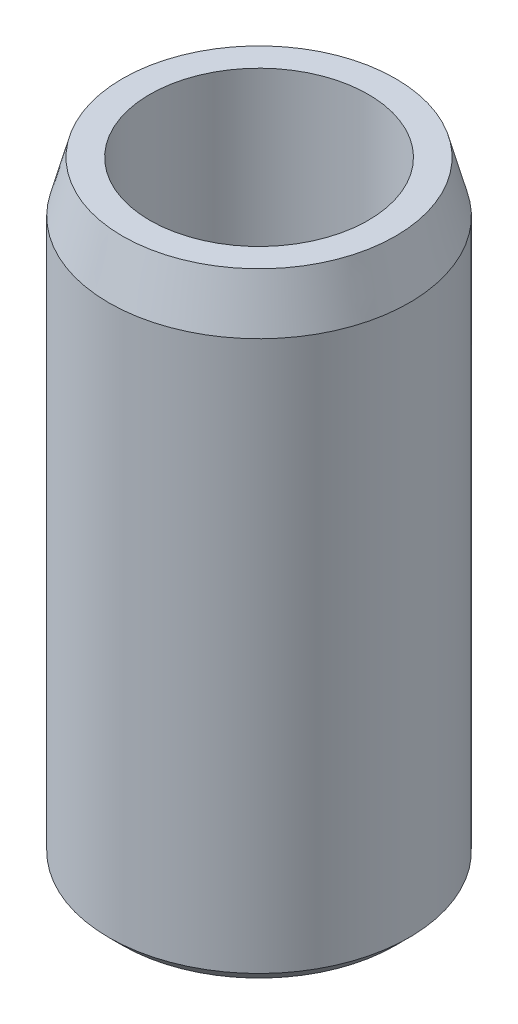
ISO-10303-21;
HEADER;
FILE_DESCRIPTION(('STEP AP214'),'2;1');
FILE_NAME('part.step','',(''),(''),'','','');
FILE_SCHEMA(('AUTOMOTIVE_DESIGN { 1 0 10303 214 1 1 1 1 }'));
ENDSEC;
DATA;
#1=APPLICATION_CONTEXT('core data for automotive mechanical design processes');
#2=APPLICATION_PROTOCOL_DEFINITION('international standard','automotive_design',2000,#1);
#3=PRODUCT_CONTEXT('',#1,'mechanical');
#4=PRODUCT('Part','Part','',(#3));
#5=PRODUCT_RELATED_PRODUCT_CATEGORY('part','',(#4));
#6=PRODUCT_DEFINITION_FORMATION('','',#4);
#7=PRODUCT_DEFINITION_CONTEXT('part definition',#1,'design');
#8=PRODUCT_DEFINITION('design','',#6,#7);
#9=PRODUCT_DEFINITION_SHAPE('','',#8);
#10=(LENGTH_UNIT() NAMED_UNIT(*) SI_UNIT(.MILLI.,.METRE.));
#11=(NAMED_UNIT(*) PLANE_ANGLE_UNIT() SI_UNIT($,.RADIAN.));
#12=(NAMED_UNIT(*) SI_UNIT($,.STERADIAN.) SOLID_ANGLE_UNIT());
#13=UNCERTAINTY_MEASURE_WITH_UNIT(LENGTH_MEASURE(1.E-05),#10,'distance_accuracy_value','');
#14=(GEOMETRIC_REPRESENTATION_CONTEXT(3) GLOBAL_UNCERTAINTY_ASSIGNED_CONTEXT((#13)) GLOBAL_UNIT_ASSIGNED_CONTEXT((#10,
#11,#12)) REPRESENTATION_CONTEXT('',''));
#15=CARTESIAN_POINT('',(0.,0.,0.));
#16=DIRECTION('',(0.,0.,1.));
#17=DIRECTION('',(1.,0.,0.));
#18=AXIS2_PLACEMENT_3D('',#15,#16,#17);
#19=CARTESIAN_POINT('',(0.,-90.,0.));
#20=DIRECTION('',(0.,1.,0.));
#21=DIRECTION('',(0.,0.,1.));
#22=AXIS2_PLACEMENT_3D('',#19,#20,#21);
#23=CYLINDRICAL_SURFACE('',#22,22.);
#24=CARTESIAN_POINT('',(0.,-88.,0.));
#25=DIRECTION('',(0.,1.,0.));
#26=DIRECTION('',(0.,0.,1.));
#27=AXIS2_PLACEMENT_3D('',#24,#25,#26);
#28=CIRCLE('',#27,22.);
#29=CARTESIAN_POINT('',(0.,-88.,22.));
#30=VERTEX_POINT('',#29);
#31=EDGE_CURVE('E49',#30,#30,#28,.T.);
#32=CARTESIAN_POINT('',(0.,-7.46410161513829,0.));
#33=DIRECTION('',(0.,1.,0.));
#34=DIRECTION('',(0.,0.,1.));
#35=AXIS2_PLACEMENT_3D('',#32,#33,#34);
#36=CIRCLE('',#35,22.);
#37=CARTESIAN_POINT('',(0.,-7.46410161513829,22.));
#38=VERTEX_POINT('',#37);
#39=EDGE_CURVE('E53',#38,#38,#36,.F.);
#40=CARTESIAN_POINT('',(0.,-88.,22.));
#41=CARTESIAN_POINT('',(0.,-87.1610843918243,22.));
#42=CARTESIAN_POINT('',(0.,-86.3221687836487,22.));
#43=CARTESIAN_POINT('',(0.,-84.6443375672974,22.));
#44=CARTESIAN_POINT('',(0.,-83.8054219591218,22.));
#45=CARTESIAN_POINT('',(0.,-82.1275907427705,22.));
#46=CARTESIAN_POINT('',(0.,-81.2886751345948,22.));
#47=CARTESIAN_POINT('',(0.,-79.6108439182435,22.));
#48=CARTESIAN_POINT('',(0.,-78.7719283100679,22.));
#49=CARTESIAN_POINT('',(0.,-77.0940970937166,22.));
#50=CARTESIAN_POINT('',(0.,-76.255181485541,22.));
#51=CARTESIAN_POINT('',(0.,-74.5773502691897,22.));
#52=CARTESIAN_POINT('',(0.,-73.7384346610141,22.));
#53=CARTESIAN_POINT('',(0.,-72.0606034446628,22.));
#54=CARTESIAN_POINT('',(0.,-71.2216878364871,22.));
#55=CARTESIAN_POINT('',(0.,-69.5438566201358,22.));
#56=CARTESIAN_POINT('',(0.,-68.7049410119602,22.));
#57=CARTESIAN_POINT('',(0.,-67.0271097956089,22.));
#58=CARTESIAN_POINT('',(0.,-66.1881941874333,22.));
#59=CARTESIAN_POINT('',(0.,-64.510362971082,22.));
#60=CARTESIAN_POINT('',(0.,-63.6714473629063,22.));
#61=CARTESIAN_POINT('',(0.,-61.9936161465551,22.));
#62=CARTESIAN_POINT('',(0.,-61.1547005383794,22.));
#63=CARTESIAN_POINT('',(0.,-59.4768693220281,22.));
#64=CARTESIAN_POINT('',(0.,-58.6379537138525,22.));
#65=CARTESIAN_POINT('',(0.,-56.9601224975012,22.));
#66=CARTESIAN_POINT('',(0.,-56.1212068893256,22.));
#67=CARTESIAN_POINT('',(0.,-54.4433756729743,22.));
#68=CARTESIAN_POINT('',(0.,-53.6044600647986,22.));
#69=CARTESIAN_POINT('',(0.,-51.9266288484473,22.));
#70=CARTESIAN_POINT('',(0.,-51.0877132402717,22.));
#71=CARTESIAN_POINT('',(0.,-49.4098820239204,22.));
#72=CARTESIAN_POINT('',(0.,-48.5709664157448,22.));
#73=CARTESIAN_POINT('',(0.,-46.8931351993935,22.));
#74=CARTESIAN_POINT('',(0.,-46.0542195912179,22.));
#75=CARTESIAN_POINT('',(0.,-44.3763883748666,22.));
#76=CARTESIAN_POINT('',(0.,-43.5374727666909,22.));
#77=CARTESIAN_POINT('',(0.,-41.8596415503396,22.));
#78=CARTESIAN_POINT('',(0.,-41.020725942164,22.));
#79=CARTESIAN_POINT('',(0.,-39.3428947258127,22.));
#80=CARTESIAN_POINT('',(0.,-38.5039791176371,22.));
#81=CARTESIAN_POINT('',(0.,-36.8261479012858,22.));
#82=CARTESIAN_POINT('',(0.,-35.9872322931101,22.));
#83=CARTESIAN_POINT('',(0.,-34.3094010767589,22.));
#84=CARTESIAN_POINT('',(0.,-33.4704854685832,22.));
#85=CARTESIAN_POINT('',(0.,-31.7926542522319,22.));
#86=CARTESIAN_POINT('',(0.,-30.9537386440563,22.));
#87=CARTESIAN_POINT('',(0.,-29.275907427705,22.));
#88=CARTESIAN_POINT('',(0.,-28.4369918195294,22.));
#89=CARTESIAN_POINT('',(0.,-26.7591606031781,22.));
#90=CARTESIAN_POINT('',(0.,-25.9202449950024,22.));
#91=CARTESIAN_POINT('',(0.,-24.2424137786511,22.));
#92=CARTESIAN_POINT('',(0.,-23.4034981704755,22.));
#93=CARTESIAN_POINT('',(0.,-21.7256669541242,22.));
#94=CARTESIAN_POINT('',(0.,-20.8867513459486,22.));
#95=CARTESIAN_POINT('',(0.,-19.2089201295973,22.));
#96=CARTESIAN_POINT('',(0.,-18.3700045214216,22.));
#97=CARTESIAN_POINT('',(0.,-16.6921733050704,22.));
#98=CARTESIAN_POINT('',(0.,-15.8532576968947,22.));
#99=CARTESIAN_POINT('',(0.,-14.1754264805434,22.));
#100=CARTESIAN_POINT('',(0.,-13.3365108723678,22.));
#101=CARTESIAN_POINT('',(0.,-11.6586796560165,22.));
#102=CARTESIAN_POINT('',(0.,-10.8197640478409,22.));
#103=CARTESIAN_POINT('',(0.,-9.14193283148958,22.));
#104=CARTESIAN_POINT('',(0.,-8.30301722331393,22.));
#105=CARTESIAN_POINT('',(0.,-7.46410161513829,22.));
#106=B_SPLINE_CURVE_WITH_KNOTS('',3,(#40,#41,#42,#43,#44,#45,#46,#47,#48,#49,#50,#51,#52,#53,
#54,#55,#56,#57,#58,#59,#60,#61,#62,#63,#64,#65,#66,#67,#68,#69,#70,#71,#72,#73,#74,#75,#76,#77,
#78,#79,#80,#81,#82,#83,#84,#85,#86,#87,#88,#89,#90,#91,#92,#93,#94,#95,#96,#97,#98,#99,#100,
#101,#102,#103,#104,#105),.UNSPECIFIED.,.F.,.F.,(4,2,2,2,2,2,2,2,2,2,2,2,2,2,2,2,2,2,2,2,2,2,2,
2,2,2,2,2,2,2,2,2,4),(0.,2.51674682452693,5.03349364905387,7.55024047358079,10.0669872981077,
12.5837341226347,15.1004809471616,17.6172277716885,20.1339745962154,22.6507214207424,
25.1674682452693,27.6842150697962,30.2009618943231,32.7177087188501,35.234455543377,
37.7512023679039,40.2679491924308,42.7846960169578,45.3014428414847,47.8181896660116,
50.3349364905386,52.8516833150655,55.3684301395924,57.8851769641193,60.4019237886463,
62.9186706131732,65.4354174377001,67.9521642622271,70.468911086754,72.9856579112809,
75.5024047358078,78.0191515603348,80.5358983848617),.UNSPECIFIED.);
#107=EDGE_CURVE('BSEAM41',#30,#38,#106,.T.);
#108=ORIENTED_EDGE('',*,*,#31,.T.);
#109=ORIENTED_EDGE('',*,*,#39,.T.);
#110=ORIENTED_EDGE('',*,*,#107,.T.);
#111=ORIENTED_EDGE('',*,*,#107,.F.);
#112=EDGE_LOOP('',(#108,#110,#109,#111));
#113=FACE_BOUND('',#112,.T.);
#114=ADVANCED_FACE('F41',(#113),#23,.T.);
#115=CARTESIAN_POINT('',(0.,-90.,0.));
#116=DIRECTION('',(0.,1.,0.));
#117=DIRECTION('',(0.,0.,1.));
#118=AXIS2_PLACEMENT_3D('',#115,#116,#117);
#119=PLANE('',#118);
#120=CARTESIAN_POINT('',(0.,-90.,0.));
#121=DIRECTION('',(0.,1.,0.));
#122=DIRECTION('',(0.,0.,1.));
#123=AXIS2_PLACEMENT_3D('',#120,#121,#122);
#124=CIRCLE('',#123,19.9999999999999);
#125=CARTESIAN_POINT('',(0.,-90.,19.9999999999999));
#126=VERTEX_POINT('',#125);
#127=EDGE_CURVE('E10',#126,#126,#124,.F.);
#128=ORIENTED_EDGE('',*,*,#127,.T.);
#129=EDGE_LOOP('',(#128));
#130=FACE_BOUND('',#129,.T.);
#131=CARTESIAN_POINT('',(0.,-90.,0.));
#132=DIRECTION('',(0.,1.,0.));
#133=DIRECTION('',(0.,0.,1.));
#134=AXIS2_PLACEMENT_3D('',#131,#132,#133);
#135=CIRCLE('',#134,16.);
#136=CARTESIAN_POINT('',(0.,-90.,16.));
#137=VERTEX_POINT('',#136);
#138=EDGE_CURVE('E62',#137,#137,#135,.T.);
#139=ORIENTED_EDGE('',*,*,#138,.T.);
#140=EDGE_LOOP('',(#139));
#141=FACE_BOUND('',#140,.T.);
#142=ADVANCED_FACE('F69',(#130,#141),#119,.F.);
#143=CARTESIAN_POINT('',(0.,0.,0.));
#144=DIRECTION('',(0.,1.,0.));
#145=DIRECTION('',(0.,0.,1.));
#146=AXIS2_PLACEMENT_3D('',#143,#144,#145);
#147=PLANE('',#146);
#148=CARTESIAN_POINT('',(0.,0.,0.));
#149=DIRECTION('',(0.,1.,0.));
#150=DIRECTION('',(0.,0.,1.));
#151=AXIS2_PLACEMENT_3D('',#148,#149,#150);
#152=CIRCLE('',#151,19.9999999999999);
#153=CARTESIAN_POINT('',(0.,0.,19.9999999999999));
#154=VERTEX_POINT('',#153);
#155=EDGE_CURVE('E57',#154,#154,#152,.T.);
#156=ORIENTED_EDGE('',*,*,#155,.T.);
#157=EDGE_LOOP('',(#156));
#158=FACE_BOUND('',#157,.T.);
#159=CARTESIAN_POINT('',(0.,0.,0.));
#160=DIRECTION('',(0.,1.,0.));
#161=DIRECTION('',(0.,0.,1.));
#162=AXIS2_PLACEMENT_3D('',#159,#160,#161);
#163=CIRCLE('',#162,16.);
#164=CARTESIAN_POINT('',(0.,0.,16.));
#165=VERTEX_POINT('',#164);
#166=EDGE_CURVE('E63',#165,#165,#163,.T.);
#167=ORIENTED_EDGE('',*,*,#166,.F.);
#168=EDGE_LOOP('',(#167));
#169=FACE_BOUND('',#168,.T.);
#170=ADVANCED_FACE('F75',(#158,#169),#147,.T.);
#171=CARTESIAN_POINT('',(0.,-90.,0.));
#172=DIRECTION('',(0.,1.,0.));
#173=DIRECTION('',(0.,0.,1.));
#174=AXIS2_PLACEMENT_3D('',#171,#172,#173);
#175=CYLINDRICAL_SURFACE('',#174,16.);
#176=CARTESIAN_POINT('',(0.,-90.,16.));
#177=CARTESIAN_POINT('',(0.,-89.0625,16.));
#178=CARTESIAN_POINT('',(0.,-88.125,16.));
#179=CARTESIAN_POINT('',(0.,-86.25,16.));
#180=CARTESIAN_POINT('',(0.,-85.3125,16.));
#181=CARTESIAN_POINT('',(0.,-83.4375,16.));
#182=CARTESIAN_POINT('',(0.,-82.5,16.));
#183=CARTESIAN_POINT('',(0.,-80.625,16.));
#184=CARTESIAN_POINT('',(0.,-79.6875,16.));
#185=CARTESIAN_POINT('',(0.,-77.8125,16.));
#186=CARTESIAN_POINT('',(0.,-76.875,16.));
#187=CARTESIAN_POINT('',(0.,-75.,16.));
#188=CARTESIAN_POINT('',(0.,-74.0625,16.));
#189=CARTESIAN_POINT('',(0.,-72.1875,16.));
#190=CARTESIAN_POINT('',(0.,-71.25,16.));
#191=CARTESIAN_POINT('',(0.,-69.375,16.));
#192=CARTESIAN_POINT('',(0.,-68.4375,16.));
#193=CARTESIAN_POINT('',(0.,-66.5625,16.));
#194=CARTESIAN_POINT('',(0.,-65.625,16.));
#195=CARTESIAN_POINT('',(0.,-63.75,16.));
#196=CARTESIAN_POINT('',(0.,-62.8125,16.));
#197=CARTESIAN_POINT('',(0.,-60.9375,16.));
#198=CARTESIAN_POINT('',(0.,-60.,16.));
#199=CARTESIAN_POINT('',(0.,-58.125,16.));
#200=CARTESIAN_POINT('',(0.,-57.1875,16.));
#201=CARTESIAN_POINT('',(0.,-55.3125,16.));
#202=CARTESIAN_POINT('',(0.,-54.375,16.));
#203=CARTESIAN_POINT('',(0.,-52.5,16.));
#204=CARTESIAN_POINT('',(0.,-51.5625,16.));
#205=CARTESIAN_POINT('',(0.,-49.6875,16.));
#206=CARTESIAN_POINT('',(0.,-48.75,16.));
#207=CARTESIAN_POINT('',(0.,-46.875,16.));
#208=CARTESIAN_POINT('',(0.,-45.9375,16.));
#209=CARTESIAN_POINT('',(0.,-44.0625,16.));
#210=CARTESIAN_POINT('',(0.,-43.125,16.));
#211=CARTESIAN_POINT('',(0.,-41.25,16.));
#212=CARTESIAN_POINT('',(0.,-40.3125,16.));
#213=CARTESIAN_POINT('',(0.,-38.4375,16.));
#214=CARTESIAN_POINT('',(0.,-37.5,16.));
#215=CARTESIAN_POINT('',(0.,-35.625,16.));
#216=CARTESIAN_POINT('',(0.,-34.6875,16.));
#217=CARTESIAN_POINT('',(0.,-32.8125,16.));
#218=CARTESIAN_POINT('',(0.,-31.875,16.));
#219=CARTESIAN_POINT('',(0.,-30.,16.));
#220=CARTESIAN_POINT('',(0.,-29.0625,16.));
#221=CARTESIAN_POINT('',(0.,-27.1875,16.));
#222=CARTESIAN_POINT('',(0.,-26.25,16.));
#223=CARTESIAN_POINT('',(0.,-24.375,16.));
#224=CARTESIAN_POINT('',(0.,-23.4375,16.));
#225=CARTESIAN_POINT('',(0.,-21.5625,16.));
#226=CARTESIAN_POINT('',(0.,-20.625,16.));
#227=CARTESIAN_POINT('',(0.,-18.75,16.));
#228=CARTESIAN_POINT('',(0.,-17.8125,16.));
#229=CARTESIAN_POINT('',(0.,-15.9375,16.));
#230=CARTESIAN_POINT('',(0.,-15.,16.));
#231=CARTESIAN_POINT('',(0.,-13.125,16.));
#232=CARTESIAN_POINT('',(0.,-12.1875,16.));
#233=CARTESIAN_POINT('',(0.,-10.3125,16.));
#234=CARTESIAN_POINT('',(0.,-9.37500000000001,16.));
#235=CARTESIAN_POINT('',(0.,-7.50000000000002,16.));
#236=CARTESIAN_POINT('',(0.,-6.56250000000002,16.));
#237=CARTESIAN_POINT('',(0.,-4.68750000000002,16.));
#238=CARTESIAN_POINT('',(0.,-3.75000000000001,16.));
#239=CARTESIAN_POINT('',(0.,-1.87500000000001,16.));
#240=CARTESIAN_POINT('',(0.,-0.937500000000014,16.));
#241=CARTESIAN_POINT('',(0.,0.,16.));
#242=B_SPLINE_CURVE_WITH_KNOTS('',3,(#176,#177,#178,#179,#180,#181,#182,#183,#184,#185,#186,
#187,#188,#189,#190,#191,#192,#193,#194,#195,#196,#197,#198,#199,#200,#201,#202,#203,#204,#205,
#206,#207,#208,#209,#210,#211,#212,#213,#214,#215,#216,#217,#218,#219,#220,#221,#222,#223,#224,
#225,#226,#227,#228,#229,#230,#231,#232,#233,#234,#235,#236,#237,#238,#239,#240,#241),
.UNSPECIFIED.,.F.,.F.,(4,2,2,2,2,2,2,2,2,2,2,2,2,2,2,2,2,2,2,2,2,2,2,2,2,2,2,2,2,2,2,2,4),(0.,
2.8125,5.62499999999999,8.43749999999999,11.25,14.0625,16.875,19.6875,22.5,25.3125,28.125,
30.9375,33.75,36.5625,39.375,42.1875,45.,47.8125,50.625,53.4375,56.25,59.0625,61.875,64.6875,
67.5,70.3125,73.125,75.9375,78.75,81.5625,84.375,87.1875,90.),.UNSPECIFIED.);
#243=EDGE_CURVE('BSEAM71',#137,#165,#242,.T.);
#244=ORIENTED_EDGE('',*,*,#138,.F.);
#245=ORIENTED_EDGE('',*,*,#166,.T.);
#246=ORIENTED_EDGE('',*,*,#243,.T.);
#247=ORIENTED_EDGE('',*,*,#243,.F.);
#248=EDGE_LOOP('',(#244,#246,#245,#247));
#249=FACE_BOUND('',#248,.T.);
#250=ADVANCED_FACE('F71',(#249),#175,.F.);
#251=CARTESIAN_POINT('',(0.,0.,0.));
#252=DIRECTION('',(0.,-1.,0.));
#253=DIRECTION('',(0.,0.,-1.));
#254=AXIS2_PLACEMENT_3D('',#251,#252,#253);
#255=CONICAL_SURFACE('',#254,19.9999999999999,0.26179938779915);
#256=ORIENTED_EDGE('',*,*,#39,.F.);
#257=EDGE_LOOP('',(#256));
#258=FACE_BOUND('',#257,.T.);
#259=ORIENTED_EDGE('',*,*,#155,.F.);
#260=EDGE_LOOP('',(#259));
#261=FACE_BOUND('',#260,.T.);
#262=ADVANCED_FACE('F74',(#258,#261),#255,.T.);
#263=CARTESIAN_POINT('',(0.,-88.,0.));
#264=DIRECTION('',(0.,1.,0.));
#265=DIRECTION('',(0.,0.,1.));
#266=AXIS2_PLACEMENT_3D('',#263,#264,#265);
#267=CONICAL_SURFACE('',#266,22.,0.785398163397454);
#268=ORIENTED_EDGE('',*,*,#127,.F.);
#269=EDGE_LOOP('',(#268));
#270=FACE_BOUND('',#269,.T.);
#271=ORIENTED_EDGE('',*,*,#31,.F.);
#272=EDGE_LOOP('',(#271));
#273=FACE_BOUND('',#272,.T.);
#274=ADVANCED_FACE('F44',(#270,#273),#267,.T.);
#275=CLOSED_SHELL('',(#114,#142,#170,#250,#262,#274));
#276=MANIFOLD_SOLID_BREP('B2',#275);
#277=ADVANCED_BREP_SHAPE_REPRESENTATION('',(#18,#276),#14);
#278=SHAPE_DEFINITION_REPRESENTATION(#9,#277);
ENDSEC;
END-ISO-10303-21;
